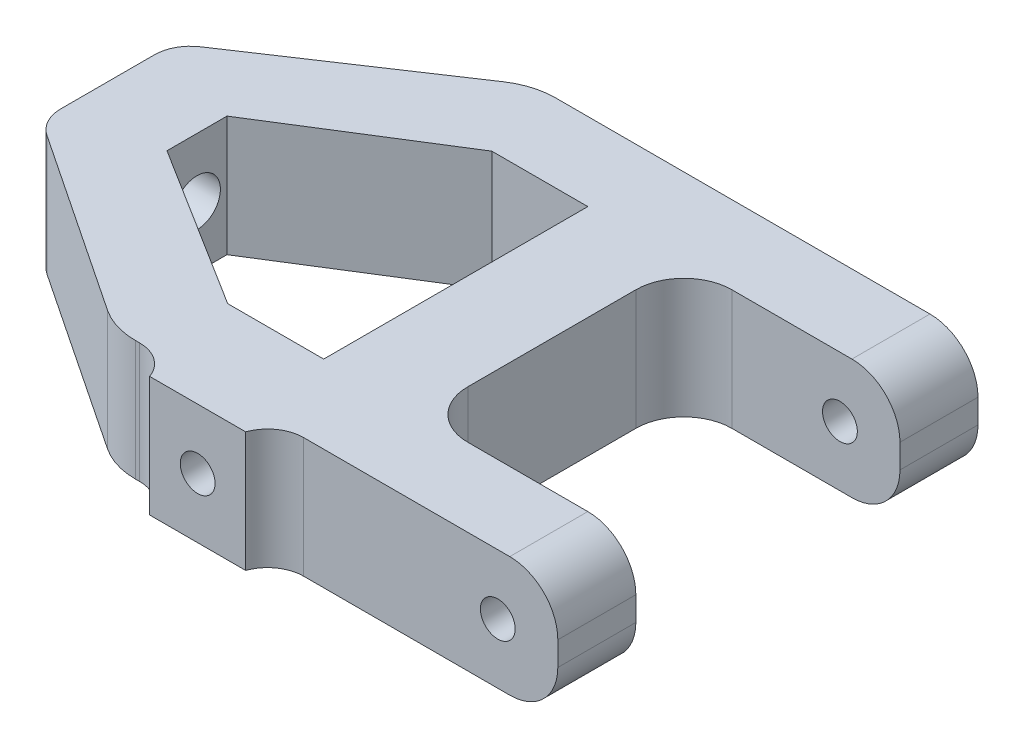
ISO-10303-21;
HEADER;
FILE_DESCRIPTION(('STEP AP214'),'2;1');
FILE_NAME('part.step','',(''),(''),'','','');
FILE_SCHEMA(('AUTOMOTIVE_DESIGN { 1 0 10303 214 1 1 1 1 }'));
ENDSEC;
DATA;
#1=APPLICATION_CONTEXT('core data for automotive mechanical design processes');
#2=APPLICATION_PROTOCOL_DEFINITION('international standard','automotive_design',2000,#1);
#3=PRODUCT_CONTEXT('',#1,'mechanical');
#4=PRODUCT('Part','Part','',(#3));
#5=PRODUCT_RELATED_PRODUCT_CATEGORY('part','',(#4));
#6=PRODUCT_DEFINITION_FORMATION('','',#4);
#7=PRODUCT_DEFINITION_CONTEXT('part definition',#1,'design');
#8=PRODUCT_DEFINITION('design','',#6,#7);
#9=PRODUCT_DEFINITION_SHAPE('','',#8);
#10=(LENGTH_UNIT() NAMED_UNIT(*) SI_UNIT(.MILLI.,.METRE.));
#11=(NAMED_UNIT(*) PLANE_ANGLE_UNIT() SI_UNIT($,.RADIAN.));
#12=(NAMED_UNIT(*) SI_UNIT($,.STERADIAN.) SOLID_ANGLE_UNIT());
#13=UNCERTAINTY_MEASURE_WITH_UNIT(LENGTH_MEASURE(1.E-05),#10,'distance_accuracy_value','');
#14=(GEOMETRIC_REPRESENTATION_CONTEXT(3) GLOBAL_UNCERTAINTY_ASSIGNED_CONTEXT((#13)) GLOBAL_UNIT_ASSIGNED_CONTEXT((#10,
#11,#12)) REPRESENTATION_CONTEXT('',''));
#15=CARTESIAN_POINT('',(0.,0.,0.));
#16=DIRECTION('',(0.,0.,1.));
#17=DIRECTION('',(1.,0.,0.));
#18=AXIS2_PLACEMENT_3D('',#15,#16,#17);
#19=CARTESIAN_POINT('',(0.,10.,35.));
#20=DIRECTION('',(0.,0.,-1.));
#21=DIRECTION('',(-1.,0.,0.));
#22=AXIS2_PLACEMENT_3D('',#19,#20,#21);
#23=PLANE('',#22);
#24=DIRECTION('',(1.,0.,0.));
#25=VECTOR('',#24,1.);
#26=CARTESIAN_POINT('',(0.,0.,35.));
#27=LINE('',#26,#25);
#28=CARTESIAN_POINT('',(19.816653826392,0.,35.));
#29=VERTEX_POINT('',#28);
#30=CARTESIAN_POINT('',(20.1715728752538,0.,35.));
#31=VERTEX_POINT('',#30);
#32=EDGE_CURVE('E365',#29,#31,#27,.T.);
#33=ORIENTED_EDGE('',*,*,#32,.T.);
#34=DIRECTION('',(0.,-1.,0.));
#35=VECTOR('',#34,1.);
#36=CARTESIAN_POINT('',(20.1715728752538,10.,35.));
#37=LINE('',#36,#35);
#38=CARTESIAN_POINT('',(20.1715728752538,10.,35.));
#39=VERTEX_POINT('',#38);
#40=EDGE_CURVE('E234',#31,#39,#37,.F.);
#41=ORIENTED_EDGE('',*,*,#40,.T.);
#42=DIRECTION('',(1.,0.,0.));
#43=VECTOR('',#42,1.);
#44=CARTESIAN_POINT('',(0.,10.,35.));
#45=LINE('',#44,#43);
#46=CARTESIAN_POINT('',(19.816653826392,10.,35.));
#47=VERTEX_POINT('',#46);
#48=EDGE_CURVE('E355',#47,#39,#45,.T.);
#49=ORIENTED_EDGE('',*,*,#48,.F.);
#50=DIRECTION('',(0.,-1.,0.));
#51=VECTOR('',#50,1.);
#52=CARTESIAN_POINT('',(19.816653826392,10.,35.));
#53=LINE('',#52,#51);
#54=EDGE_CURVE('E439',#47,#29,#53,.T.);
#55=ORIENTED_EDGE('',*,*,#54,.T.);
#56=EDGE_LOOP('',(#33,#41,#49,#55));
#57=FACE_BOUND('',#56,.T.);
#58=ADVANCED_FACE('F33',(#57),#23,.F.);
#59=CARTESIAN_POINT('',(50.,5.,35.));
#60=DIRECTION('',(0.,0.,1.));
#61=DIRECTION('',(1.,0.,0.));
#62=AXIS2_PLACEMENT_3D('',#59,#60,#61);
#63=CIRCLE('',#62,1.45);
#64=CARTESIAN_POINT('',(51.45,5.,35.));
#65=VERTEX_POINT('',#64);
#66=EDGE_CURVE('E269',#65,#65,#63,.T.);
#67=ORIENTED_EDGE('',*,*,#66,.F.);
#68=EDGE_LOOP('',(#67));
#69=FACE_BOUND('',#68,.T.);
#70=CARTESIAN_POINT('',(33.8284271247462,10.,35.));
#71=VERTEX_POINT('',#70);
#72=CARTESIAN_POINT('',(51.,10.,35.));
#73=VERTEX_POINT('',#72);
#74=EDGE_CURVE('E353',#71,#73,#45,.T.);
#75=ORIENTED_EDGE('',*,*,#74,.F.);
#76=DIRECTION('',(0.,1.,0.));
#77=VECTOR('',#76,1.);
#78=CARTESIAN_POINT('',(33.8284271247462,10.,35.));
#79=LINE('',#78,#77);
#80=CARTESIAN_POINT('',(33.8284271247462,0.,35.));
#81=VERTEX_POINT('',#80);
#82=EDGE_CURVE('E54',#71,#81,#79,.F.);
#83=ORIENTED_EDGE('',*,*,#82,.T.);
#84=CARTESIAN_POINT('',(51.,0.,35.));
#85=VERTEX_POINT('',#84);
#86=EDGE_CURVE('E364',#81,#85,#27,.T.);
#87=ORIENTED_EDGE('',*,*,#86,.T.);
#88=CARTESIAN_POINT('',(51.,4.,35.));
#89=DIRECTION('',(0.,0.,-1.));
#90=DIRECTION('',(-1.,0.,0.));
#91=AXIS2_PLACEMENT_3D('',#88,#89,#90);
#92=CIRCLE('',#91,4.);
#93=CARTESIAN_POINT('',(55.,4.,35.));
#94=VERTEX_POINT('',#93);
#95=EDGE_CURVE('E394',#85,#94,#92,.F.);
#96=ORIENTED_EDGE('',*,*,#95,.T.);
#97=DIRECTION('',(0.,-1.,0.));
#98=VECTOR('',#97,1.);
#99=CARTESIAN_POINT('',(55.,10.,35.));
#100=LINE('',#99,#98);
#101=CARTESIAN_POINT('',(55.,6.,35.));
#102=VERTEX_POINT('',#101);
#103=EDGE_CURVE('E371',#102,#94,#100,.T.);
#104=ORIENTED_EDGE('',*,*,#103,.F.);
#105=CARTESIAN_POINT('',(51.,6.,35.));
#106=DIRECTION('',(0.,0.,-1.));
#107=DIRECTION('',(-1.,0.,0.));
#108=AXIS2_PLACEMENT_3D('',#105,#106,#107);
#109=CIRCLE('',#108,4.);
#110=EDGE_CURVE('E396',#102,#73,#109,.F.);
#111=ORIENTED_EDGE('',*,*,#110,.T.);
#112=EDGE_LOOP('',(#75,#83,#87,#96,#104,#111));
#113=FACE_BOUND('',#112,.T.);
#114=ADVANCED_FACE('F565',(#69,#113),#23,.F.);
#115=CARTESIAN_POINT('',(21.,10.,28.5));
#116=DIRECTION('',(0.,0.,1.));
#117=DIRECTION('',(1.,0.,0.));
#118=AXIS2_PLACEMENT_3D('',#115,#116,#117);
#119=PLANE('',#118);
#120=CARTESIAN_POINT('',(27.,5.,28.5));
#121=DIRECTION('',(0.,0.,1.));
#122=DIRECTION('',(1.,0.,0.));
#123=AXIS2_PLACEMENT_3D('',#120,#121,#122);
#124=CIRCLE('',#123,1.45);
#125=CARTESIAN_POINT('',(28.45,5.,28.5));
#126=VERTEX_POINT('',#125);
#127=EDGE_CURVE('E252',#126,#126,#124,.T.);
#128=ORIENTED_EDGE('',*,*,#127,.T.);
#129=EDGE_LOOP('',(#128));
#130=FACE_BOUND('',#129,.T.);
#131=DIRECTION('',(1.,0.,0.));
#132=VECTOR('',#131,1.);
#133=CARTESIAN_POINT('',(21.,10.,28.5));
#134=LINE('',#133,#132);
#135=CARTESIAN_POINT('',(21.,10.,28.5));
#136=VERTEX_POINT('',#135);
#137=CARTESIAN_POINT('',(29.,10.,28.5));
#138=VERTEX_POINT('',#137);
#139=EDGE_CURVE('E335',#136,#138,#134,.T.);
#140=ORIENTED_EDGE('',*,*,#139,.T.);
#141=DIRECTION('',(0.,-1.,0.));
#142=VECTOR('',#141,1.);
#143=CARTESIAN_POINT('',(29.,10.,28.5));
#144=LINE('',#143,#142);
#145=CARTESIAN_POINT('',(29.,0.,28.5));
#146=VERTEX_POINT('',#145);
#147=EDGE_CURVE('E288',#138,#146,#144,.T.);
#148=ORIENTED_EDGE('',*,*,#147,.T.);
#149=DIRECTION('',(1.,0.,0.));
#150=VECTOR('',#149,1.);
#151=CARTESIAN_POINT('',(21.,0.,28.5));
#152=LINE('',#151,#150);
#153=CARTESIAN_POINT('',(21.,0.,28.5));
#154=VERTEX_POINT('',#153);
#155=EDGE_CURVE('E347',#154,#146,#152,.T.);
#156=ORIENTED_EDGE('',*,*,#155,.F.);
#157=DIRECTION('',(0.,-1.,0.));
#158=VECTOR('',#157,1.);
#159=CARTESIAN_POINT('',(21.,10.,28.5));
#160=LINE('',#159,#158);
#161=EDGE_CURVE('E325',#136,#154,#160,.T.);
#162=ORIENTED_EDGE('',*,*,#161,.F.);
#163=EDGE_LOOP('',(#140,#148,#156,#162));
#164=FACE_BOUND('',#163,.T.);
#165=ADVANCED_FACE('F570',(#130,#164),#119,.F.);
#166=CARTESIAN_POINT('',(21.,10.,6.5));
#167=DIRECTION('',(0.,0.,-1.));
#168=DIRECTION('',(0.,1.,0.));
#169=AXIS2_PLACEMENT_3D('',#166,#167,#168);
#170=PLANE('',#169);
#171=DIRECTION('',(1.,0.,0.));
#172=VECTOR('',#171,1.);
#173=CARTESIAN_POINT('',(21.,0.,6.5));
#174=LINE('',#173,#172);
#175=CARTESIAN_POINT('',(21.,0.,6.5));
#176=VERTEX_POINT('',#175);
#177=CARTESIAN_POINT('',(29.,0.,6.5));
#178=VERTEX_POINT('',#177);
#179=EDGE_CURVE('E344',#176,#178,#174,.T.);
#180=ORIENTED_EDGE('',*,*,#179,.T.);
#181=DIRECTION('',(0.,-1.,0.));
#182=VECTOR('',#181,1.);
#183=CARTESIAN_POINT('',(29.,10.,6.5));
#184=LINE('',#183,#182);
#185=CARTESIAN_POINT('',(29.,10.,6.5));
#186=VERTEX_POINT('',#185);
#187=EDGE_CURVE('E283',#186,#178,#184,.T.);
#188=ORIENTED_EDGE('',*,*,#187,.F.);
#189=DIRECTION('',(1.,0.,0.));
#190=VECTOR('',#189,1.);
#191=CARTESIAN_POINT('',(21.,10.,6.5));
#192=LINE('',#191,#190);
#193=CARTESIAN_POINT('',(21.,10.,6.5));
#194=VERTEX_POINT('',#193);
#195=EDGE_CURVE('E340',#194,#186,#192,.T.);
#196=ORIENTED_EDGE('',*,*,#195,.F.);
#197=DIRECTION('',(0.,1.,0.));
#198=VECTOR('',#197,1.);
#199=CARTESIAN_POINT('',(21.,10.,6.5));
#200=LINE('',#199,#198);
#201=EDGE_CURVE('E327',#176,#194,#200,.T.);
#202=ORIENTED_EDGE('',*,*,#201,.F.);
#203=EDGE_LOOP('',(#180,#188,#196,#202));
#204=FACE_BOUND('',#203,.T.);
#205=ADVANCED_FACE('F646',(#204),#170,.F.);
#206=CARTESIAN_POINT('',(55.,10.,0.));
#207=DIRECTION('',(-1.,0.,0.));
#208=DIRECTION('',(0.,0.,1.));
#209=AXIS2_PLACEMENT_3D('',#206,#207,#208);
#210=PLANE('',#209);
#211=DIRECTION('',(0.,-1.,0.));
#212=VECTOR('',#211,1.);
#213=CARTESIAN_POINT('',(55.,10.,28.5));
#214=LINE('',#213,#212);
#215=CARTESIAN_POINT('',(55.,6.,28.5));
#216=VERTEX_POINT('',#215);
#217=CARTESIAN_POINT('',(55.,4.,28.5));
#218=VERTEX_POINT('',#217);
#219=EDGE_CURVE('E323',#216,#218,#214,.T.);
#220=ORIENTED_EDGE('',*,*,#219,.F.);
#221=DIRECTION('',(0.,0.,-1.));
#222=VECTOR('',#221,1.);
#223=CARTESIAN_POINT('',(55.,6.,35.));
#224=LINE('',#223,#222);
#225=EDGE_CURVE('E392',#216,#102,#224,.F.);
#226=ORIENTED_EDGE('',*,*,#225,.T.);
#227=ORIENTED_EDGE('',*,*,#103,.T.);
#228=DIRECTION('',(0.,0.,-1.));
#229=VECTOR('',#228,1.);
#230=CARTESIAN_POINT('',(55.,4.,0.));
#231=LINE('',#230,#229);
#232=EDGE_CURVE('E389',#94,#218,#231,.T.);
#233=ORIENTED_EDGE('',*,*,#232,.T.);
#234=EDGE_LOOP('',(#220,#226,#227,#233));
#235=FACE_BOUND('',#234,.T.);
#236=ADVANCED_FACE('F577',(#235),#210,.F.);
#237=CARTESIAN_POINT('',(0.,10.,0.));
#238=DIRECTION('',(1.,0.,0.));
#239=DIRECTION('',(0.,0.,-1.));
#240=AXIS2_PLACEMENT_3D('',#237,#238,#239);
#241=PLANE('',#240);
#242=CARTESIAN_POINT('',(0.,5.,17.5));
#243=DIRECTION('',(-1.,0.,0.));
#244=DIRECTION('',(0.,0.,1.));
#245=AXIS2_PLACEMENT_3D('',#242,#243,#244);
#246=CIRCLE('',#245,1.95);
#247=CARTESIAN_POINT('',(0.,5.,19.45));
#248=VERTEX_POINT('',#247);
#249=EDGE_CURVE('E261',#248,#248,#246,.T.);
#250=ORIENTED_EDGE('',*,*,#249,.F.);
#251=EDGE_LOOP('',(#250));
#252=FACE_BOUND('',#251,.T.);
#253=DIRECTION('',(0.,0.,1.));
#254=VECTOR('',#253,1.);
#255=CARTESIAN_POINT('',(0.,10.,0.));
#256=LINE('',#255,#254);
#257=CARTESIAN_POINT('',(0.,10.,13.605551275464));
#258=VERTEX_POINT('',#257);
#259=CARTESIAN_POINT('',(0.,10.,21.394448724536));
#260=VERTEX_POINT('',#259);
#261=EDGE_CURVE('E350',#258,#260,#256,.T.);
#262=ORIENTED_EDGE('',*,*,#261,.F.);
#263=DIRECTION('',(0.,-1.,0.));
#264=VECTOR('',#263,1.);
#265=CARTESIAN_POINT('',(0.,10.,13.605551275464));
#266=LINE('',#265,#264);
#267=CARTESIAN_POINT('',(0.,0.,13.605551275464));
#268=VERTEX_POINT('',#267);
#269=EDGE_CURVE('E421',#258,#268,#266,.T.);
#270=ORIENTED_EDGE('',*,*,#269,.T.);
#271=DIRECTION('',(0.,0.,1.));
#272=VECTOR('',#271,1.);
#273=CARTESIAN_POINT('',(0.,0.,0.));
#274=LINE('',#273,#272);
#275=CARTESIAN_POINT('',(0.,0.,21.394448724536));
#276=VERTEX_POINT('',#275);
#277=EDGE_CURVE('E338',#268,#276,#274,.T.);
#278=ORIENTED_EDGE('',*,*,#277,.T.);
#279=DIRECTION('',(0.,-1.,0.));
#280=VECTOR('',#279,1.);
#281=CARTESIAN_POINT('',(0.,10.,21.394448724536));
#282=LINE('',#281,#280);
#283=EDGE_CURVE('E419',#276,#260,#282,.F.);
#284=ORIENTED_EDGE('',*,*,#283,.T.);
#285=EDGE_LOOP('',(#262,#270,#278,#284));
#286=FACE_BOUND('',#285,.T.);
#287=ADVANCED_FACE('F497',(#252,#286),#241,.F.);
#288=DIRECTION('',(0.,-1.,0.));
#289=VECTOR('',#288,1.);
#290=CARTESIAN_POINT('',(55.,10.,0.));
#291=LINE('',#290,#289);
#292=CARTESIAN_POINT('',(55.,6.,0.));
#293=VERTEX_POINT('',#292);
#294=CARTESIAN_POINT('',(55.,4.,0.));
#295=VERTEX_POINT('',#294);
#296=EDGE_CURVE('E361',#293,#295,#291,.T.);
#297=ORIENTED_EDGE('',*,*,#296,.F.);
#298=DIRECTION('',(0.,0.,-1.));
#299=VECTOR('',#298,1.);
#300=CARTESIAN_POINT('',(55.,6.,6.5));
#301=LINE('',#300,#299);
#302=CARTESIAN_POINT('',(55.,6.,6.5));
#303=VERTEX_POINT('',#302);
#304=EDGE_CURVE('E412',#293,#303,#301,.F.);
#305=ORIENTED_EDGE('',*,*,#304,.T.);
#306=DIRECTION('',(0.,1.,0.));
#307=VECTOR('',#306,1.);
#308=CARTESIAN_POINT('',(55.,10.,6.5));
#309=LINE('',#308,#307);
#310=CARTESIAN_POINT('',(55.,4.,6.5));
#311=VERTEX_POINT('',#310);
#312=EDGE_CURVE('E328',#311,#303,#309,.T.);
#313=ORIENTED_EDGE('',*,*,#312,.F.);
#314=DIRECTION('',(0.,0.,-1.));
#315=VECTOR('',#314,1.);
#316=CARTESIAN_POINT('',(55.,4.,0.));
#317=LINE('',#316,#315);
#318=EDGE_CURVE('E409',#311,#295,#317,.T.);
#319=ORIENTED_EDGE('',*,*,#318,.T.);
#320=EDGE_LOOP('',(#297,#305,#313,#319));
#321=FACE_BOUND('',#320,.T.);
#322=ADVANCED_FACE('F524',(#321),#210,.F.);
#323=CARTESIAN_POINT('',(0.,10.,0.));
#324=DIRECTION('',(0.,0.,1.));
#325=DIRECTION('',(1.,0.,0.));
#326=AXIS2_PLACEMENT_3D('',#323,#324,#325);
#327=PLANE('',#326);
#328=CARTESIAN_POINT('',(50.,5.,0.));
#329=DIRECTION('',(0.,0.,1.));
#330=DIRECTION('',(1.,0.,0.));
#331=AXIS2_PLACEMENT_3D('',#328,#329,#330);
#332=CIRCLE('',#331,1.45);
#333=CARTESIAN_POINT('',(51.45,5.,0.));
#334=VERTEX_POINT('',#333);
#335=EDGE_CURVE('E265',#334,#334,#332,.T.);
#336=ORIENTED_EDGE('',*,*,#335,.T.);
#337=EDGE_LOOP('',(#336));
#338=FACE_BOUND('',#337,.T.);
#339=DIRECTION('',(-1.,0.,0.));
#340=VECTOR('',#339,1.);
#341=CARTESIAN_POINT('',(0.,0.,0.));
#342=LINE('',#341,#340);
#343=CARTESIAN_POINT('',(51.,0.,0.));
#344=VERTEX_POINT('',#343);
#345=CARTESIAN_POINT('',(19.816653826392,0.,0.));
#346=VERTEX_POINT('',#345);
#347=EDGE_CURVE('E354',#344,#346,#342,.T.);
#348=ORIENTED_EDGE('',*,*,#347,.T.);
#349=DIRECTION('',(0.,-1.,0.));
#350=VECTOR('',#349,1.);
#351=CARTESIAN_POINT('',(19.816653826392,10.,0.));
#352=LINE('',#351,#350);
#353=CARTESIAN_POINT('',(19.816653826392,10.,0.));
#354=VERTEX_POINT('',#353);
#355=EDGE_CURVE('E455',#346,#354,#352,.F.);
#356=ORIENTED_EDGE('',*,*,#355,.T.);
#357=DIRECTION('',(-1.,0.,0.));
#358=VECTOR('',#357,1.);
#359=CARTESIAN_POINT('',(0.,10.,0.));
#360=LINE('',#359,#358);
#361=CARTESIAN_POINT('',(51.,10.,0.));
#362=VERTEX_POINT('',#361);
#363=EDGE_CURVE('E358',#362,#354,#360,.T.);
#364=ORIENTED_EDGE('',*,*,#363,.F.);
#365=CARTESIAN_POINT('',(51.,6.,0.));
#366=DIRECTION('',(0.,0.,1.));
#367=DIRECTION('',(1.,0.,0.));
#368=AXIS2_PLACEMENT_3D('',#365,#366,#367);
#369=CIRCLE('',#368,4.);
#370=EDGE_CURVE('E407',#362,#293,#369,.F.);
#371=ORIENTED_EDGE('',*,*,#370,.T.);
#372=ORIENTED_EDGE('',*,*,#296,.T.);
#373=CARTESIAN_POINT('',(51.,4.,0.));
#374=DIRECTION('',(0.,0.,1.));
#375=DIRECTION('',(1.,0.,0.));
#376=AXIS2_PLACEMENT_3D('',#373,#374,#375);
#377=CIRCLE('',#376,4.);
#378=EDGE_CURVE('E405',#295,#344,#377,.F.);
#379=ORIENTED_EDGE('',*,*,#378,.T.);
#380=EDGE_LOOP('',(#348,#356,#364,#371,#372,#379));
#381=FACE_BOUND('',#380,.T.);
#382=ADVANCED_FACE('F515',(#338,#381),#327,.F.);
#383=CARTESIAN_POINT('',(0.,10.,0.));
#384=DIRECTION('',(0.,1.,0.));
#385=DIRECTION('',(0.,0.,1.));
#386=AXIS2_PLACEMENT_3D('',#383,#384,#385);
#387=PLANE('',#386);
#388=DIRECTION('',(0.,0.,-1.));
#389=VECTOR('',#388,1.);
#390=CARTESIAN_POINT('',(29.,10.,28.5));
#391=LINE('',#390,#389);
#392=EDGE_CURVE('E276',#138,#186,#391,.T.);
#393=ORIENTED_EDGE('',*,*,#392,.F.);
#394=ORIENTED_EDGE('',*,*,#139,.F.);
#395=DIRECTION('',(-0.847215106982872,0.,-0.53125));
#396=VECTOR('',#395,1.);
#397=CARTESIAN_POINT('',(7.44455828827404,10.,20.));
#398=LINE('',#397,#396);
#399=CARTESIAN_POINT('',(7.44455828827404,10.,20.));
#400=VERTEX_POINT('',#399);
#401=EDGE_CURVE('E294',#136,#400,#398,.T.);
#402=ORIENTED_EDGE('',*,*,#401,.T.);
#403=DIRECTION('',(0.,0.,-1.));
#404=VECTOR('',#403,1.);
#405=CARTESIAN_POINT('',(7.44455828827404,10.,15.));
#406=LINE('',#405,#404);
#407=CARTESIAN_POINT('',(7.44455828827404,10.,15.));
#408=VERTEX_POINT('',#407);
#409=EDGE_CURVE('E297',#400,#408,#406,.T.);
#410=ORIENTED_EDGE('',*,*,#409,.T.);
#411=DIRECTION('',(0.847215106982872,0.,-0.53125));
#412=VECTOR('',#411,1.);
#413=CARTESIAN_POINT('',(21.,10.,6.5));
#414=LINE('',#413,#412);
#415=EDGE_CURVE('E301',#408,#194,#414,.T.);
#416=ORIENTED_EDGE('',*,*,#415,.T.);
#417=ORIENTED_EDGE('',*,*,#195,.T.);
#418=EDGE_LOOP('',(#393,#394,#402,#410,#416,#417));
#419=FACE_BOUND('',#418,.T.);
#420=DIRECTION('',(0.832050294337844,0.,0.554700196225229));
#421=VECTOR('',#420,1.);
#422=CARTESIAN_POINT('',(0.,10.,23.));
#423=LINE('',#422,#421);
#424=CARTESIAN_POINT('',(1.33589941132432,10.,23.8905996075495));
#425=VERTEX_POINT('',#424);
#426=CARTESIAN_POINT('',(16.4884526490406,10.,33.9923017660271));
#427=VERTEX_POINT('',#426);
#428=EDGE_CURVE('E315',#425,#427,#423,.T.);
#429=ORIENTED_EDGE('',*,*,#428,.T.);
#430=CARTESIAN_POINT('',(19.816653826392,10.,29.));
#431=DIRECTION('',(0.,1.,0.));
#432=DIRECTION('',(0.,0.,1.));
#433=AXIS2_PLACEMENT_3D('',#430,#431,#432);
#434=CIRCLE('',#433,6.);
#435=EDGE_CURVE('E450',#427,#47,#434,.T.);
#436=ORIENTED_EDGE('',*,*,#435,.T.);
#437=ORIENTED_EDGE('',*,*,#48,.T.);
#438=CARTESIAN_POINT('',(20.1715728752538,10.,38.));
#439=DIRECTION('',(0.,1.,0.));
#440=DIRECTION('',(0.,0.,1.));
#441=AXIS2_PLACEMENT_3D('',#438,#439,#440);
#442=CIRCLE('',#441,3.);
#443=CARTESIAN_POINT('',(23.,10.,37.));
#444=VERTEX_POINT('',#443);
#445=EDGE_CURVE('E238',#39,#444,#442,.F.);
#446=ORIENTED_EDGE('',*,*,#445,.T.);
#447=DIRECTION('',(-1.,0.,0.));
#448=VECTOR('',#447,1.);
#449=CARTESIAN_POINT('',(23.,10.,37.));
#450=LINE('',#449,#448);
#451=CARTESIAN_POINT('',(31.,10.,37.));
#452=VERTEX_POINT('',#451);
#453=EDGE_CURVE('E251',#452,#444,#450,.T.);
#454=ORIENTED_EDGE('',*,*,#453,.F.);
#455=CARTESIAN_POINT('',(33.8284271247462,10.,38.));
#456=DIRECTION('',(0.,1.,0.));
#457=DIRECTION('',(0.,0.,1.));
#458=AXIS2_PLACEMENT_3D('',#455,#456,#457);
#459=CIRCLE('',#458,3.);
#460=EDGE_CURVE('E41',#452,#71,#459,.F.);
#461=ORIENTED_EDGE('',*,*,#460,.T.);
#462=ORIENTED_EDGE('',*,*,#74,.T.);
#463=DIRECTION('',(0.,0.,-1.));
#464=VECTOR('',#463,1.);
#465=CARTESIAN_POINT('',(51.,10.,28.5));
#466=LINE('',#465,#464);
#467=CARTESIAN_POINT('',(51.,10.,28.5));
#468=VERTEX_POINT('',#467);
#469=EDGE_CURVE('E381',#73,#468,#466,.T.);
#470=ORIENTED_EDGE('',*,*,#469,.T.);
#471=CARTESIAN_POINT('',(41.,10.,28.5));
#472=VERTEX_POINT('',#471);
#473=EDGE_CURVE('E339',#472,#468,#134,.T.);
#474=ORIENTED_EDGE('',*,*,#473,.F.);
#475=CARTESIAN_POINT('',(41.,10.,24.5));
#476=DIRECTION('',(0.,1.,0.));
#477=DIRECTION('',(0.,0.,1.));
#478=AXIS2_PLACEMENT_3D('',#475,#476,#477);
#479=CIRCLE('',#478,4.);
#480=CARTESIAN_POINT('',(37.,10.,24.5));
#481=VERTEX_POINT('',#480);
#482=EDGE_CURVE('E469',#472,#481,#479,.F.);
#483=ORIENTED_EDGE('',*,*,#482,.T.);
#484=DIRECTION('',(0.,0.,1.));
#485=VECTOR('',#484,1.);
#486=CARTESIAN_POINT('',(37.,10.,28.5));
#487=LINE('',#486,#485);
#488=CARTESIAN_POINT('',(37.,10.,10.5));
#489=VERTEX_POINT('',#488);
#490=EDGE_CURVE('E279',#489,#481,#487,.T.);
#491=ORIENTED_EDGE('',*,*,#490,.F.);
#492=CARTESIAN_POINT('',(41.,10.,10.5));
#493=DIRECTION('',(0.,1.,0.));
#494=DIRECTION('',(0.,0.,1.));
#495=AXIS2_PLACEMENT_3D('',#492,#493,#494);
#496=CIRCLE('',#495,4.);
#497=CARTESIAN_POINT('',(41.,10.,6.5));
#498=VERTEX_POINT('',#497);
#499=EDGE_CURVE('E473',#489,#498,#496,.F.);
#500=ORIENTED_EDGE('',*,*,#499,.T.);
#501=CARTESIAN_POINT('',(51.,10.,6.5));
#502=VERTEX_POINT('',#501);
#503=EDGE_CURVE('E343',#498,#502,#192,.T.);
#504=ORIENTED_EDGE('',*,*,#503,.T.);
#505=DIRECTION('',(0.,0.,-1.));
#506=VECTOR('',#505,1.);
#507=CARTESIAN_POINT('',(51.,10.,0.));
#508=LINE('',#507,#506);
#509=EDGE_CURVE('E374',#502,#362,#508,.T.);
#510=ORIENTED_EDGE('',*,*,#509,.T.);
#511=ORIENTED_EDGE('',*,*,#363,.T.);
#512=CARTESIAN_POINT('',(19.816653826392,10.,6.));
#513=DIRECTION('',(0.,1.,0.));
#514=DIRECTION('',(0.,0.,1.));
#515=AXIS2_PLACEMENT_3D('',#512,#513,#514);
#516=CIRCLE('',#515,6.);
#517=CARTESIAN_POINT('',(16.4884526490406,10.,1.00769823397294));
#518=VERTEX_POINT('',#517);
#519=EDGE_CURVE('E448',#354,#518,#516,.T.);
#520=ORIENTED_EDGE('',*,*,#519,.T.);
#521=DIRECTION('',(-0.832050294337844,0.,0.554700196225229));
#522=VECTOR('',#521,1.);
#523=CARTESIAN_POINT('',(0.,10.,12.));
#524=LINE('',#523,#522);
#525=CARTESIAN_POINT('',(1.33589941132432,10.,11.1094003924505));
#526=VERTEX_POINT('',#525);
#527=EDGE_CURVE('E321',#518,#526,#524,.T.);
#528=ORIENTED_EDGE('',*,*,#527,.T.);
#529=CARTESIAN_POINT('',(3.,10.,13.605551275464));
#530=DIRECTION('',(0.,1.,0.));
#531=DIRECTION('',(0.,0.,1.));
#532=AXIS2_PLACEMENT_3D('',#529,#530,#531);
#533=CIRCLE('',#532,3.);
#534=EDGE_CURVE('E434',#526,#258,#533,.T.);
#535=ORIENTED_EDGE('',*,*,#534,.T.);
#536=ORIENTED_EDGE('',*,*,#261,.T.);
#537=CARTESIAN_POINT('',(3.,10.,21.394448724536));
#538=DIRECTION('',(0.,1.,0.));
#539=DIRECTION('',(0.,0.,1.));
#540=AXIS2_PLACEMENT_3D('',#537,#538,#539);
#541=CIRCLE('',#540,3.);
#542=EDGE_CURVE('E432',#260,#425,#541,.T.);
#543=ORIENTED_EDGE('',*,*,#542,.T.);
#544=EDGE_LOOP('',(#429,#436,#437,#446,#454,#461,#462,#470,#474,#483,#491,#500,#504,#510,#511,
#520,#528,#535,#536,#543));
#545=FACE_BOUND('',#544,.T.);
#546=ADVANCED_FACE('F477',(#419,#545),#387,.T.);
#547=CARTESIAN_POINT('',(0.,0.,0.));
#548=DIRECTION('',(0.,1.,0.));
#549=DIRECTION('',(0.,0.,1.));
#550=AXIS2_PLACEMENT_3D('',#547,#548,#549);
#551=PLANE('',#550);
#552=ORIENTED_EDGE('',*,*,#155,.T.);
#553=DIRECTION('',(0.,0.,-1.));
#554=VECTOR('',#553,1.);
#555=CARTESIAN_POINT('',(29.,0.,28.5));
#556=LINE('',#555,#554);
#557=EDGE_CURVE('E275',#146,#178,#556,.T.);
#558=ORIENTED_EDGE('',*,*,#557,.T.);
#559=ORIENTED_EDGE('',*,*,#179,.F.);
#560=DIRECTION('',(0.847215106982872,0.,-0.53125));
#561=VECTOR('',#560,1.);
#562=CARTESIAN_POINT('',(21.,0.,6.5));
#563=LINE('',#562,#561);
#564=CARTESIAN_POINT('',(7.44455828827404,0.,15.));
#565=VERTEX_POINT('',#564);
#566=EDGE_CURVE('E298',#565,#176,#563,.T.);
#567=ORIENTED_EDGE('',*,*,#566,.F.);
#568=DIRECTION('',(0.,0.,-1.));
#569=VECTOR('',#568,1.);
#570=CARTESIAN_POINT('',(7.44455828827404,0.,15.));
#571=LINE('',#570,#569);
#572=CARTESIAN_POINT('',(7.44455828827404,0.,20.));
#573=VERTEX_POINT('',#572);
#574=EDGE_CURVE('E307',#573,#565,#571,.T.);
#575=ORIENTED_EDGE('',*,*,#574,.F.);
#576=DIRECTION('',(-0.847215106982872,0.,-0.53125));
#577=VECTOR('',#576,1.);
#578=CARTESIAN_POINT('',(7.44455828827404,0.,20.));
#579=LINE('',#578,#577);
#580=EDGE_CURVE('E291',#154,#573,#579,.T.);
#581=ORIENTED_EDGE('',*,*,#580,.F.);
#582=EDGE_LOOP('',(#552,#558,#559,#567,#575,#581));
#583=FACE_BOUND('',#582,.T.);
#584=ORIENTED_EDGE('',*,*,#32,.F.);
#585=CARTESIAN_POINT('',(19.816653826392,0.,29.));
#586=DIRECTION('',(0.,1.,0.));
#587=DIRECTION('',(0.,0.,1.));
#588=AXIS2_PLACEMENT_3D('',#585,#586,#587);
#589=CIRCLE('',#588,6.);
#590=CARTESIAN_POINT('',(16.4884526490406,0.,33.9923017660271));
#591=VERTEX_POINT('',#590);
#592=EDGE_CURVE('E444',#29,#591,#589,.F.);
#593=ORIENTED_EDGE('',*,*,#592,.T.);
#594=DIRECTION('',(0.832050294337844,0.,0.554700196225229));
#595=VECTOR('',#594,1.);
#596=CARTESIAN_POINT('',(0.,0.,23.));
#597=LINE('',#596,#595);
#598=CARTESIAN_POINT('',(1.33589941132432,0.,23.8905996075495));
#599=VERTEX_POINT('',#598);
#600=EDGE_CURVE('E313',#599,#591,#597,.T.);
#601=ORIENTED_EDGE('',*,*,#600,.F.);
#602=CARTESIAN_POINT('',(3.,0.,21.394448724536));
#603=DIRECTION('',(0.,1.,0.));
#604=DIRECTION('',(0.,0.,1.));
#605=AXIS2_PLACEMENT_3D('',#602,#603,#604);
#606=CIRCLE('',#605,3.);
#607=EDGE_CURVE('E424',#599,#276,#606,.F.);
#608=ORIENTED_EDGE('',*,*,#607,.T.);
#609=ORIENTED_EDGE('',*,*,#277,.F.);
#610=CARTESIAN_POINT('',(3.,0.,13.605551275464));
#611=DIRECTION('',(0.,1.,0.));
#612=DIRECTION('',(0.,0.,1.));
#613=AXIS2_PLACEMENT_3D('',#610,#611,#612);
#614=CIRCLE('',#613,3.);
#615=CARTESIAN_POINT('',(1.33589941132432,0.,11.1094003924505));
#616=VERTEX_POINT('',#615);
#617=EDGE_CURVE('E426',#268,#616,#614,.F.);
#618=ORIENTED_EDGE('',*,*,#617,.T.);
#619=DIRECTION('',(-0.832050294337844,0.,0.554700196225229));
#620=VECTOR('',#619,1.);
#621=CARTESIAN_POINT('',(0.,0.,12.));
#622=LINE('',#621,#620);
#623=CARTESIAN_POINT('',(16.4884526490406,0.,1.00769823397294));
#624=VERTEX_POINT('',#623);
#625=EDGE_CURVE('E318',#624,#616,#622,.T.);
#626=ORIENTED_EDGE('',*,*,#625,.F.);
#627=CARTESIAN_POINT('',(19.816653826392,0.,6.));
#628=DIRECTION('',(0.,1.,0.));
#629=DIRECTION('',(0.,0.,1.));
#630=AXIS2_PLACEMENT_3D('',#627,#628,#629);
#631=CIRCLE('',#630,6.);
#632=EDGE_CURVE('E442',#624,#346,#631,.F.);
#633=ORIENTED_EDGE('',*,*,#632,.T.);
#634=ORIENTED_EDGE('',*,*,#347,.F.);
#635=DIRECTION('',(0.,0.,-1.));
#636=VECTOR('',#635,1.);
#637=CARTESIAN_POINT('',(51.,0.,0.));
#638=LINE('',#637,#636);
#639=CARTESIAN_POINT('',(51.,0.,6.5));
#640=VERTEX_POINT('',#639);
#641=EDGE_CURVE('E399',#344,#640,#638,.F.);
#642=ORIENTED_EDGE('',*,*,#641,.T.);
#643=CARTESIAN_POINT('',(41.,0.,6.5));
#644=VERTEX_POINT('',#643);
#645=EDGE_CURVE('E346',#644,#640,#174,.T.);
#646=ORIENTED_EDGE('',*,*,#645,.F.);
#647=CARTESIAN_POINT('',(41.,0.,10.5));
#648=DIRECTION('',(0.,1.,0.));
#649=DIRECTION('',(0.,0.,1.));
#650=AXIS2_PLACEMENT_3D('',#647,#648,#649);
#651=CIRCLE('',#650,4.);
#652=CARTESIAN_POINT('',(37.,0.,10.5));
#653=VERTEX_POINT('',#652);
#654=EDGE_CURVE('E471',#644,#653,#651,.T.);
#655=ORIENTED_EDGE('',*,*,#654,.T.);
#656=DIRECTION('',(0.,0.,1.));
#657=VECTOR('',#656,1.);
#658=CARTESIAN_POINT('',(37.,0.,28.5));
#659=LINE('',#658,#657);
#660=CARTESIAN_POINT('',(37.,0.,24.5));
#661=VERTEX_POINT('',#660);
#662=EDGE_CURVE('E280',#653,#661,#659,.T.);
#663=ORIENTED_EDGE('',*,*,#662,.T.);
#664=CARTESIAN_POINT('',(41.,0.,24.5));
#665=DIRECTION('',(0.,1.,0.));
#666=DIRECTION('',(0.,0.,1.));
#667=AXIS2_PLACEMENT_3D('',#664,#665,#666);
#668=CIRCLE('',#667,4.);
#669=CARTESIAN_POINT('',(41.,0.,28.5));
#670=VERTEX_POINT('',#669);
#671=EDGE_CURVE('E467',#661,#670,#668,.T.);
#672=ORIENTED_EDGE('',*,*,#671,.T.);
#673=CARTESIAN_POINT('',(51.,0.,28.5));
#674=VERTEX_POINT('',#673);
#675=EDGE_CURVE('E330',#670,#674,#152,.T.);
#676=ORIENTED_EDGE('',*,*,#675,.T.);
#677=DIRECTION('',(0.,0.,-1.));
#678=VECTOR('',#677,1.);
#679=CARTESIAN_POINT('',(51.,0.,0.));
#680=LINE('',#679,#678);
#681=EDGE_CURVE('E402',#674,#85,#680,.F.);
#682=ORIENTED_EDGE('',*,*,#681,.T.);
#683=ORIENTED_EDGE('',*,*,#86,.F.);
#684=CARTESIAN_POINT('',(33.8284271247462,0.,38.));
#685=DIRECTION('',(0.,1.,0.));
#686=DIRECTION('',(0.,0.,1.));
#687=AXIS2_PLACEMENT_3D('',#684,#685,#686);
#688=CIRCLE('',#687,3.);
#689=CARTESIAN_POINT('',(31.,0.,37.));
#690=VERTEX_POINT('',#689);
#691=EDGE_CURVE('E11',#81,#690,#688,.T.);
#692=ORIENTED_EDGE('',*,*,#691,.T.);
#693=DIRECTION('',(1.,0.,0.));
#694=VECTOR('',#693,1.);
#695=CARTESIAN_POINT('',(23.,0.,37.));
#696=LINE('',#695,#694);
#697=CARTESIAN_POINT('',(23.,0.,37.));
#698=VERTEX_POINT('',#697);
#699=EDGE_CURVE('E241',#698,#690,#696,.T.);
#700=ORIENTED_EDGE('',*,*,#699,.F.);
#701=CARTESIAN_POINT('',(20.1715728752538,0.,38.));
#702=DIRECTION('',(0.,1.,0.));
#703=DIRECTION('',(0.,0.,1.));
#704=AXIS2_PLACEMENT_3D('',#701,#702,#703);
#705=CIRCLE('',#704,3.);
#706=EDGE_CURVE('E228',#698,#31,#705,.T.);
#707=ORIENTED_EDGE('',*,*,#706,.T.);
#708=EDGE_LOOP('',(#584,#593,#601,#608,#609,#618,#626,#633,#634,#642,#646,#655,#663,#672,#676,
#682,#683,#692,#700,#707));
#709=FACE_BOUND('',#708,.T.);
#710=ADVANCED_FACE('F242',(#583,#709),#551,.F.);
#711=CARTESIAN_POINT('',(50.,5.,28.5));
#712=DIRECTION('',(0.,0.,1.));
#713=DIRECTION('',(1.,0.,0.));
#714=AXIS2_PLACEMENT_3D('',#711,#712,#713);
#715=CIRCLE('',#714,1.45);
#716=CARTESIAN_POINT('',(51.45,5.,28.5));
#717=VERTEX_POINT('',#716);
#718=EDGE_CURVE('E272',#717,#717,#715,.T.);
#719=ORIENTED_EDGE('',*,*,#718,.T.);
#720=EDGE_LOOP('',(#719));
#721=FACE_BOUND('',#720,.T.);
#722=ORIENTED_EDGE('',*,*,#675,.F.);
#723=DIRECTION('',(0.,-1.,0.));
#724=VECTOR('',#723,1.);
#725=CARTESIAN_POINT('',(41.,10.,28.5));
#726=LINE('',#725,#724);
#727=EDGE_CURVE('E462',#670,#472,#726,.F.);
#728=ORIENTED_EDGE('',*,*,#727,.T.);
#729=ORIENTED_EDGE('',*,*,#473,.T.);
#730=CARTESIAN_POINT('',(51.,6.,28.5));
#731=DIRECTION('',(0.,0.,1.));
#732=DIRECTION('',(1.,0.,0.));
#733=AXIS2_PLACEMENT_3D('',#730,#731,#732);
#734=CIRCLE('',#733,4.);
#735=EDGE_CURVE('E387',#468,#216,#734,.F.);
#736=ORIENTED_EDGE('',*,*,#735,.T.);
#737=ORIENTED_EDGE('',*,*,#219,.T.);
#738=CARTESIAN_POINT('',(51.,4.,28.5));
#739=DIRECTION('',(0.,0.,1.));
#740=DIRECTION('',(1.,0.,0.));
#741=AXIS2_PLACEMENT_3D('',#738,#739,#740);
#742=CIRCLE('',#741,4.);
#743=EDGE_CURVE('E384',#218,#674,#742,.F.);
#744=ORIENTED_EDGE('',*,*,#743,.T.);
#745=EDGE_LOOP('',(#722,#728,#729,#736,#737,#744));
#746=FACE_BOUND('',#745,.T.);
#747=ADVANCED_FACE('F551',(#721,#746),#119,.F.);
#748=CARTESIAN_POINT('',(50.,5.,6.5));
#749=DIRECTION('',(0.,0.,-1.));
#750=DIRECTION('',(0.,1.,0.));
#751=AXIS2_PLACEMENT_3D('',#748,#749,#750);
#752=CIRCLE('',#751,1.45);
#753=CARTESIAN_POINT('',(50.,6.45,6.5));
#754=VERTEX_POINT('',#753);
#755=EDGE_CURVE('E268',#754,#754,#752,.T.);
#756=ORIENTED_EDGE('',*,*,#755,.T.);
#757=EDGE_LOOP('',(#756));
#758=FACE_BOUND('',#757,.T.);
#759=ORIENTED_EDGE('',*,*,#503,.F.);
#760=DIRECTION('',(0.,-1.,0.));
#761=VECTOR('',#760,1.);
#762=CARTESIAN_POINT('',(41.,10.,6.5));
#763=LINE('',#762,#761);
#764=EDGE_CURVE('E464',#498,#644,#763,.T.);
#765=ORIENTED_EDGE('',*,*,#764,.T.);
#766=ORIENTED_EDGE('',*,*,#645,.T.);
#767=CARTESIAN_POINT('',(51.,4.,6.5));
#768=DIRECTION('',(0.,0.,-1.));
#769=DIRECTION('',(0.,1.,0.));
#770=AXIS2_PLACEMENT_3D('',#767,#768,#769);
#771=CIRCLE('',#770,4.);
#772=EDGE_CURVE('E414',#640,#311,#771,.F.);
#773=ORIENTED_EDGE('',*,*,#772,.T.);
#774=ORIENTED_EDGE('',*,*,#312,.T.);
#775=CARTESIAN_POINT('',(51.,6.,6.5));
#776=DIRECTION('',(0.,0.,-1.));
#777=DIRECTION('',(0.,1.,0.));
#778=AXIS2_PLACEMENT_3D('',#775,#776,#777);
#779=CIRCLE('',#778,4.);
#780=EDGE_CURVE('E416',#303,#502,#779,.F.);
#781=ORIENTED_EDGE('',*,*,#780,.T.);
#782=EDGE_LOOP('',(#759,#765,#766,#773,#774,#781));
#783=FACE_BOUND('',#782,.T.);
#784=ADVANCED_FACE('F534',(#758,#783),#170,.F.);
#785=CARTESIAN_POINT('',(0.,10.,12.));
#786=DIRECTION('',(0.554700196225229,0.,0.832050294337844));
#787=DIRECTION('',(0.832050294337844,0.,-0.554700196225229));
#788=AXIS2_PLACEMENT_3D('',#785,#786,#787);
#789=PLANE('',#788);
#790=ORIENTED_EDGE('',*,*,#527,.F.);
#791=DIRECTION('',(0.,-1.,0.));
#792=VECTOR('',#791,1.);
#793=CARTESIAN_POINT('',(16.4884526490406,10.,1.00769823397294));
#794=LINE('',#793,#792);
#795=EDGE_CURVE('E452',#518,#624,#794,.T.);
#796=ORIENTED_EDGE('',*,*,#795,.T.);
#797=ORIENTED_EDGE('',*,*,#625,.T.);
#798=DIRECTION('',(0.,-1.,0.));
#799=VECTOR('',#798,1.);
#800=CARTESIAN_POINT('',(1.33589941132432,10.,11.1094003924505));
#801=LINE('',#800,#799);
#802=EDGE_CURVE('E429',#616,#526,#801,.F.);
#803=ORIENTED_EDGE('',*,*,#802,.T.);
#804=EDGE_LOOP('',(#790,#796,#797,#803));
#805=FACE_BOUND('',#804,.T.);
#806=ADVANCED_FACE('F507',(#805),#789,.F.);
#807=CARTESIAN_POINT('',(0.,10.,23.));
#808=DIRECTION('',(0.554700196225229,0.,-0.832050294337844));
#809=DIRECTION('',(-0.832050294337844,0.,-0.554700196225229));
#810=AXIS2_PLACEMENT_3D('',#807,#808,#809);
#811=PLANE('',#810);
#812=ORIENTED_EDGE('',*,*,#600,.T.);
#813=DIRECTION('',(0.,-1.,0.));
#814=VECTOR('',#813,1.);
#815=CARTESIAN_POINT('',(16.4884526490406,10.,33.9923017660271));
#816=LINE('',#815,#814);
#817=EDGE_CURVE('E446',#591,#427,#816,.F.);
#818=ORIENTED_EDGE('',*,*,#817,.T.);
#819=ORIENTED_EDGE('',*,*,#428,.F.);
#820=DIRECTION('',(0.,-1.,0.));
#821=VECTOR('',#820,1.);
#822=CARTESIAN_POINT('',(1.33589941132432,10.,23.8905996075495));
#823=LINE('',#822,#821);
#824=EDGE_CURVE('E436',#425,#599,#823,.T.);
#825=ORIENTED_EDGE('',*,*,#824,.T.);
#826=EDGE_LOOP('',(#812,#818,#819,#825));
#827=FACE_BOUND('',#826,.T.);
#828=ADVANCED_FACE('F487',(#827),#811,.F.);
#829=CARTESIAN_POINT('',(21.,10.,6.5));
#830=DIRECTION('',(-0.53125,0.,-0.847215106982872));
#831=DIRECTION('',(-0.847215106982872,0.,0.53125));
#832=AXIS2_PLACEMENT_3D('',#829,#830,#831);
#833=PLANE('',#832);
#834=ORIENTED_EDGE('',*,*,#566,.T.);
#835=ORIENTED_EDGE('',*,*,#201,.T.);
#836=ORIENTED_EDGE('',*,*,#415,.F.);
#837=DIRECTION('',(0.,-1.,0.));
#838=VECTOR('',#837,1.);
#839=CARTESIAN_POINT('',(7.44455828827404,10.,15.));
#840=LINE('',#839,#838);
#841=EDGE_CURVE('E311',#408,#565,#840,.T.);
#842=ORIENTED_EDGE('',*,*,#841,.T.);
#843=EDGE_LOOP('',(#834,#835,#836,#842));
#844=FACE_BOUND('',#843,.T.);
#845=ADVANCED_FACE('F628',(#844),#833,.F.);
#846=CARTESIAN_POINT('',(7.44455828827404,10.,15.));
#847=DIRECTION('',(-1.,0.,0.));
#848=DIRECTION('',(0.,0.,1.));
#849=AXIS2_PLACEMENT_3D('',#846,#847,#848);
#850=PLANE('',#849);
#851=CARTESIAN_POINT('',(7.44455828827404,5.,17.5));
#852=DIRECTION('',(-1.,0.,0.));
#853=DIRECTION('',(0.,0.,1.));
#854=AXIS2_PLACEMENT_3D('',#851,#852,#853);
#855=CIRCLE('',#854,1.95);
#856=CARTESIAN_POINT('',(7.44455828827404,5.,19.45));
#857=VERTEX_POINT('',#856);
#858=EDGE_CURVE('E264',#857,#857,#855,.T.);
#859=ORIENTED_EDGE('',*,*,#858,.T.);
#860=EDGE_LOOP('',(#859));
#861=FACE_BOUND('',#860,.T.);
#862=ORIENTED_EDGE('',*,*,#574,.T.);
#863=ORIENTED_EDGE('',*,*,#841,.F.);
#864=ORIENTED_EDGE('',*,*,#409,.F.);
#865=DIRECTION('',(0.,-1.,0.));
#866=VECTOR('',#865,1.);
#867=CARTESIAN_POINT('',(7.44455828827404,10.,20.));
#868=LINE('',#867,#866);
#869=EDGE_CURVE('E304',#400,#573,#868,.T.);
#870=ORIENTED_EDGE('',*,*,#869,.T.);
#871=EDGE_LOOP('',(#862,#863,#864,#870));
#872=FACE_BOUND('',#871,.T.);
#873=ADVANCED_FACE('F631',(#861,#872),#850,.F.);
#874=CARTESIAN_POINT('',(7.44455828827404,10.,20.));
#875=DIRECTION('',(-0.53125,0.,0.847215106982872));
#876=DIRECTION('',(0.847215106982872,0.,0.53125));
#877=AXIS2_PLACEMENT_3D('',#874,#875,#876);
#878=PLANE('',#877);
#879=ORIENTED_EDGE('',*,*,#580,.T.);
#880=ORIENTED_EDGE('',*,*,#869,.F.);
#881=ORIENTED_EDGE('',*,*,#401,.F.);
#882=ORIENTED_EDGE('',*,*,#161,.T.);
#883=EDGE_LOOP('',(#879,#880,#881,#882));
#884=FACE_BOUND('',#883,.T.);
#885=ADVANCED_FACE('F626',(#884),#878,.F.);
#886=CARTESIAN_POINT('',(29.,10.,28.5));
#887=DIRECTION('',(-1.,0.,0.));
#888=DIRECTION('',(0.,0.,1.));
#889=AXIS2_PLACEMENT_3D('',#886,#887,#888);
#890=PLANE('',#889);
#891=ORIENTED_EDGE('',*,*,#557,.F.);
#892=ORIENTED_EDGE('',*,*,#147,.F.);
#893=ORIENTED_EDGE('',*,*,#392,.T.);
#894=ORIENTED_EDGE('',*,*,#187,.T.);
#895=EDGE_LOOP('',(#891,#892,#893,#894));
#896=FACE_BOUND('',#895,.T.);
#897=ADVANCED_FACE('F623',(#896),#890,.T.);
#898=CARTESIAN_POINT('',(37.,10.,28.5));
#899=DIRECTION('',(1.,0.,0.));
#900=DIRECTION('',(0.,0.,-1.));
#901=AXIS2_PLACEMENT_3D('',#898,#899,#900);
#902=PLANE('',#901);
#903=ORIENTED_EDGE('',*,*,#490,.T.);
#904=DIRECTION('',(0.,-1.,0.));
#905=VECTOR('',#904,1.);
#906=CARTESIAN_POINT('',(37.,10.,24.5));
#907=LINE('',#906,#905);
#908=EDGE_CURVE('E459',#481,#661,#907,.T.);
#909=ORIENTED_EDGE('',*,*,#908,.T.);
#910=ORIENTED_EDGE('',*,*,#662,.F.);
#911=DIRECTION('',(0.,-1.,0.));
#912=VECTOR('',#911,1.);
#913=CARTESIAN_POINT('',(37.,10.,10.5));
#914=LINE('',#913,#912);
#915=EDGE_CURVE('E457',#653,#489,#914,.F.);
#916=ORIENTED_EDGE('',*,*,#915,.T.);
#917=EDGE_LOOP('',(#903,#909,#910,#916));
#918=FACE_BOUND('',#917,.T.);
#919=ADVANCED_FACE('F542',(#918),#902,.T.);
#920=CARTESIAN_POINT('',(50.,5.,0.));
#921=DIRECTION('',(0.,0.,1.));
#922=DIRECTION('',(1.,0.,0.));
#923=AXIS2_PLACEMENT_3D('',#920,#921,#922);
#924=CYLINDRICAL_SURFACE('',#923,1.45);
#925=ORIENTED_EDGE('',*,*,#335,.F.);
#926=EDGE_LOOP('',(#925));
#927=FACE_BOUND('',#926,.T.);
#928=ORIENTED_EDGE('',*,*,#755,.F.);
#929=EDGE_LOOP('',(#928));
#930=FACE_BOUND('',#929,.T.);
#931=ADVANCED_FACE('F619',(#927,#930),#924,.F.);
#932=ORIENTED_EDGE('',*,*,#66,.T.);
#933=EDGE_LOOP('',(#932));
#934=FACE_BOUND('',#933,.T.);
#935=ORIENTED_EDGE('',*,*,#718,.F.);
#936=EDGE_LOOP('',(#935));
#937=FACE_BOUND('',#936,.T.);
#938=ADVANCED_FACE('F615',(#934,#937),#924,.F.);
#939=CARTESIAN_POINT('',(11.,5.,17.5));
#940=DIRECTION('',(-1.,0.,0.));
#941=DIRECTION('',(0.,0.,1.));
#942=AXIS2_PLACEMENT_3D('',#939,#940,#941);
#943=CYLINDRICAL_SURFACE('',#942,1.95);
#944=ORIENTED_EDGE('',*,*,#249,.T.);
#945=EDGE_LOOP('',(#944));
#946=FACE_BOUND('',#945,.T.);
#947=ORIENTED_EDGE('',*,*,#858,.F.);
#948=EDGE_LOOP('',(#947));
#949=FACE_BOUND('',#948,.T.);
#950=ADVANCED_FACE('F582',(#946,#949),#943,.F.);
#951=CARTESIAN_POINT('',(51.,6.,0.));
#952=DIRECTION('',(0.,0.,1.));
#953=DIRECTION('',(1.,0.,0.));
#954=AXIS2_PLACEMENT_3D('',#951,#952,#953);
#955=CYLINDRICAL_SURFACE('',#954,4.);
#956=ORIENTED_EDGE('',*,*,#110,.F.);
#957=ORIENTED_EDGE('',*,*,#225,.F.);
#958=ORIENTED_EDGE('',*,*,#735,.F.);
#959=ORIENTED_EDGE('',*,*,#469,.F.);
#960=EDGE_LOOP('',(#956,#957,#958,#959));
#961=FACE_BOUND('',#960,.T.);
#962=ADVANCED_FACE('F579',(#961),#955,.T.);
#963=CARTESIAN_POINT('',(51.,4.,0.));
#964=DIRECTION('',(0.,0.,-1.));
#965=DIRECTION('',(-1.,0.,0.));
#966=AXIS2_PLACEMENT_3D('',#963,#964,#965);
#967=CYLINDRICAL_SURFACE('',#966,4.);
#968=ORIENTED_EDGE('',*,*,#95,.F.);
#969=ORIENTED_EDGE('',*,*,#681,.F.);
#970=ORIENTED_EDGE('',*,*,#743,.F.);
#971=ORIENTED_EDGE('',*,*,#232,.F.);
#972=EDGE_LOOP('',(#968,#969,#970,#971));
#973=FACE_BOUND('',#972,.T.);
#974=ADVANCED_FACE('F557',(#973),#967,.T.);
#975=CARTESIAN_POINT('',(51.,6.,0.));
#976=DIRECTION('',(0.,0.,1.));
#977=DIRECTION('',(1.,0.,0.));
#978=AXIS2_PLACEMENT_3D('',#975,#976,#977);
#979=CYLINDRICAL_SURFACE('',#978,4.);
#980=ORIENTED_EDGE('',*,*,#780,.F.);
#981=ORIENTED_EDGE('',*,*,#304,.F.);
#982=ORIENTED_EDGE('',*,*,#370,.F.);
#983=ORIENTED_EDGE('',*,*,#509,.F.);
#984=EDGE_LOOP('',(#980,#981,#982,#983));
#985=FACE_BOUND('',#984,.T.);
#986=ADVANCED_FACE('F520',(#985),#979,.T.);
#987=CARTESIAN_POINT('',(51.,4.,0.));
#988=DIRECTION('',(0.,0.,-1.));
#989=DIRECTION('',(-1.,0.,0.));
#990=AXIS2_PLACEMENT_3D('',#987,#988,#989);
#991=CYLINDRICAL_SURFACE('',#990,4.);
#992=ORIENTED_EDGE('',*,*,#772,.F.);
#993=ORIENTED_EDGE('',*,*,#641,.F.);
#994=ORIENTED_EDGE('',*,*,#378,.F.);
#995=ORIENTED_EDGE('',*,*,#318,.F.);
#996=EDGE_LOOP('',(#992,#993,#994,#995));
#997=FACE_BOUND('',#996,.T.);
#998=ADVANCED_FACE('F529',(#997),#991,.T.);
#999=CARTESIAN_POINT('',(3.,10.,13.605551275464));
#1000=DIRECTION('',(0.,-1.,0.));
#1001=DIRECTION('',(0.,0.,-1.));
#1002=AXIS2_PLACEMENT_3D('',#999,#1000,#1001);
#1003=CYLINDRICAL_SURFACE('',#1002,3.);
#1004=ORIENTED_EDGE('',*,*,#534,.F.);
#1005=ORIENTED_EDGE('',*,*,#802,.F.);
#1006=ORIENTED_EDGE('',*,*,#617,.F.);
#1007=ORIENTED_EDGE('',*,*,#269,.F.);
#1008=EDGE_LOOP('',(#1004,#1005,#1006,#1007));
#1009=FACE_BOUND('',#1008,.T.);
#1010=ADVANCED_FACE('F501',(#1009),#1003,.T.);
#1011=CARTESIAN_POINT('',(3.,10.,21.394448724536));
#1012=DIRECTION('',(0.,-1.,0.));
#1013=DIRECTION('',(0.,0.,-1.));
#1014=AXIS2_PLACEMENT_3D('',#1011,#1012,#1013);
#1015=CYLINDRICAL_SURFACE('',#1014,3.);
#1016=ORIENTED_EDGE('',*,*,#542,.F.);
#1017=ORIENTED_EDGE('',*,*,#283,.F.);
#1018=ORIENTED_EDGE('',*,*,#607,.F.);
#1019=ORIENTED_EDGE('',*,*,#824,.F.);
#1020=EDGE_LOOP('',(#1016,#1017,#1018,#1019));
#1021=FACE_BOUND('',#1020,.T.);
#1022=ADVANCED_FACE('F492',(#1021),#1015,.T.);
#1023=CARTESIAN_POINT('',(19.816653826392,10.,29.));
#1024=DIRECTION('',(0.,-1.,0.));
#1025=DIRECTION('',(0.,0.,-1.));
#1026=AXIS2_PLACEMENT_3D('',#1023,#1024,#1025);
#1027=CYLINDRICAL_SURFACE('',#1026,6.);
#1028=ORIENTED_EDGE('',*,*,#435,.F.);
#1029=ORIENTED_EDGE('',*,*,#817,.F.);
#1030=ORIENTED_EDGE('',*,*,#592,.F.);
#1031=ORIENTED_EDGE('',*,*,#54,.F.);
#1032=EDGE_LOOP('',(#1028,#1029,#1030,#1031));
#1033=FACE_BOUND('',#1032,.T.);
#1034=ADVANCED_FACE('F483',(#1033),#1027,.T.);
#1035=CARTESIAN_POINT('',(19.816653826392,10.,6.));
#1036=DIRECTION('',(0.,-1.,0.));
#1037=DIRECTION('',(0.,0.,-1.));
#1038=AXIS2_PLACEMENT_3D('',#1035,#1036,#1037);
#1039=CYLINDRICAL_SURFACE('',#1038,6.);
#1040=ORIENTED_EDGE('',*,*,#519,.F.);
#1041=ORIENTED_EDGE('',*,*,#355,.F.);
#1042=ORIENTED_EDGE('',*,*,#632,.F.);
#1043=ORIENTED_EDGE('',*,*,#795,.F.);
#1044=EDGE_LOOP('',(#1040,#1041,#1042,#1043));
#1045=FACE_BOUND('',#1044,.T.);
#1046=ADVANCED_FACE('F511',(#1045),#1039,.T.);
#1047=CARTESIAN_POINT('',(41.,10.,24.5));
#1048=DIRECTION('',(0.,-1.,0.));
#1049=DIRECTION('',(0.,0.,-1.));
#1050=AXIS2_PLACEMENT_3D('',#1047,#1048,#1049);
#1051=CYLINDRICAL_SURFACE('',#1050,4.);
#1052=ORIENTED_EDGE('',*,*,#482,.F.);
#1053=ORIENTED_EDGE('',*,*,#727,.F.);
#1054=ORIENTED_EDGE('',*,*,#671,.F.);
#1055=ORIENTED_EDGE('',*,*,#908,.F.);
#1056=EDGE_LOOP('',(#1052,#1053,#1054,#1055));
#1057=FACE_BOUND('',#1056,.T.);
#1058=ADVANCED_FACE('F548',(#1057),#1051,.F.);
#1059=CARTESIAN_POINT('',(41.,10.,10.5));
#1060=DIRECTION('',(0.,-1.,0.));
#1061=DIRECTION('',(0.,0.,-1.));
#1062=AXIS2_PLACEMENT_3D('',#1059,#1060,#1061);
#1063=CYLINDRICAL_SURFACE('',#1062,4.);
#1064=ORIENTED_EDGE('',*,*,#499,.F.);
#1065=ORIENTED_EDGE('',*,*,#915,.F.);
#1066=ORIENTED_EDGE('',*,*,#654,.F.);
#1067=ORIENTED_EDGE('',*,*,#764,.F.);
#1068=EDGE_LOOP('',(#1064,#1065,#1066,#1067));
#1069=FACE_BOUND('',#1068,.T.);
#1070=ADVANCED_FACE('F538',(#1069),#1063,.F.);
#1071=CARTESIAN_POINT('',(0.,0.,37.));
#1072=DIRECTION('',(0.,0.,1.));
#1073=DIRECTION('',(1.,0.,0.));
#1074=AXIS2_PLACEMENT_3D('',#1071,#1072,#1073);
#1075=PLANE('',#1074);
#1076=CARTESIAN_POINT('',(27.,5.,37.));
#1077=DIRECTION('',(0.,0.,1.));
#1078=DIRECTION('',(1.,0.,0.));
#1079=AXIS2_PLACEMENT_3D('',#1076,#1077,#1078);
#1080=CIRCLE('',#1079,1.45);
#1081=CARTESIAN_POINT('',(28.45,5.,37.));
#1082=VERTEX_POINT('',#1081);
#1083=EDGE_CURVE('E255',#1082,#1082,#1080,.T.);
#1084=ORIENTED_EDGE('',*,*,#1083,.F.);
#1085=EDGE_LOOP('',(#1084));
#1086=FACE_BOUND('',#1085,.T.);
#1087=DIRECTION('',(0.,-1.,0.));
#1088=VECTOR('',#1087,1.);
#1089=CARTESIAN_POINT('',(23.,10.,37.));
#1090=LINE('',#1089,#1088);
#1091=EDGE_CURVE('E233',#444,#698,#1090,.T.);
#1092=ORIENTED_EDGE('',*,*,#1091,.T.);
#1093=ORIENTED_EDGE('',*,*,#699,.T.);
#1094=DIRECTION('',(0.,1.,0.));
#1095=VECTOR('',#1094,1.);
#1096=CARTESIAN_POINT('',(31.,10.,37.));
#1097=LINE('',#1096,#1095);
#1098=EDGE_CURVE('E247',#690,#452,#1097,.T.);
#1099=ORIENTED_EDGE('',*,*,#1098,.T.);
#1100=ORIENTED_EDGE('',*,*,#453,.T.);
#1101=EDGE_LOOP('',(#1092,#1093,#1099,#1100));
#1102=FACE_BOUND('',#1101,.T.);
#1103=ADVANCED_FACE('F250',(#1086,#1102),#1075,.T.);
#1104=CARTESIAN_POINT('',(27.,5.,25.));
#1105=DIRECTION('',(0.,0.,1.));
#1106=DIRECTION('',(1.,0.,0.));
#1107=AXIS2_PLACEMENT_3D('',#1104,#1105,#1106);
#1108=CYLINDRICAL_SURFACE('',#1107,1.45);
#1109=ORIENTED_EDGE('',*,*,#1083,.T.);
#1110=EDGE_LOOP('',(#1109));
#1111=FACE_BOUND('',#1110,.T.);
#1112=ORIENTED_EDGE('',*,*,#127,.F.);
#1113=EDGE_LOOP('',(#1112));
#1114=FACE_BOUND('',#1113,.T.);
#1115=ADVANCED_FACE('F563',(#1111,#1114),#1108,.F.);
#1116=CARTESIAN_POINT('',(20.1715728752538,10.,38.));
#1117=DIRECTION('',(0.,-1.,0.));
#1118=DIRECTION('',(0.,0.,-1.));
#1119=AXIS2_PLACEMENT_3D('',#1116,#1117,#1118);
#1120=CYLINDRICAL_SURFACE('',#1119,3.);
#1121=ORIENTED_EDGE('',*,*,#445,.F.);
#1122=ORIENTED_EDGE('',*,*,#40,.F.);
#1123=ORIENTED_EDGE('',*,*,#706,.F.);
#1124=ORIENTED_EDGE('',*,*,#1091,.F.);
#1125=EDGE_LOOP('',(#1121,#1122,#1123,#1124));
#1126=FACE_BOUND('',#1125,.T.);
#1127=ADVANCED_FACE('F231',(#1126),#1120,.F.);
#1128=CARTESIAN_POINT('',(33.8284271247462,10.,38.));
#1129=DIRECTION('',(0.,1.,0.));
#1130=DIRECTION('',(0.,0.,1.));
#1131=AXIS2_PLACEMENT_3D('',#1128,#1129,#1130);
#1132=CYLINDRICAL_SURFACE('',#1131,3.);
#1133=ORIENTED_EDGE('',*,*,#691,.F.);
#1134=ORIENTED_EDGE('',*,*,#82,.F.);
#1135=ORIENTED_EDGE('',*,*,#460,.F.);
#1136=ORIENTED_EDGE('',*,*,#1098,.F.);
#1137=EDGE_LOOP('',(#1133,#1134,#1135,#1136));
#1138=FACE_BOUND('',#1137,.T.);
#1139=ADVANCED_FACE('F35',(#1138),#1132,.F.);
#1140=CLOSED_SHELL('',(#58,#114,#165,#205,#236,#287,#322,#382,#546,#710,#747,#784,#806,#828,
#845,#873,#885,#897,#919,#931,#938,#950,#962,#974,#986,#998,#1010,#1022,#1034,#1046,#1058,#1070,
#1103,#1115,#1127,#1139));
#1141=MANIFOLD_SOLID_BREP('B2',#1140);
#1142=ADVANCED_BREP_SHAPE_REPRESENTATION('',(#18,#1141),#14);
#1143=SHAPE_DEFINITION_REPRESENTATION(#9,#1142);
ENDSEC;
END-ISO-10303-21;
